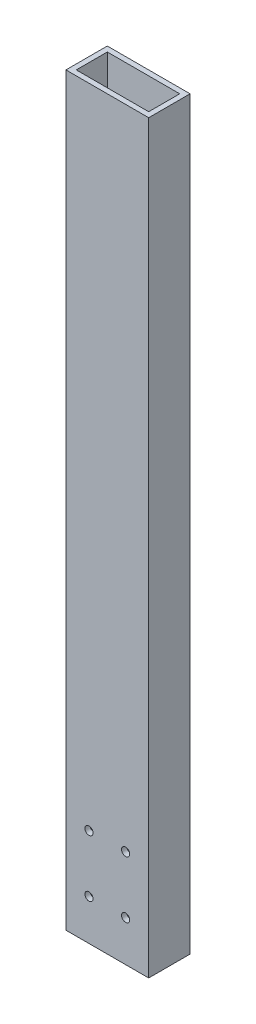
ISO-10303-21;
HEADER;
FILE_DESCRIPTION(('STEP AP214'),'2;1');
FILE_NAME('part.step','',(''),(''),'','','');
FILE_SCHEMA(('AUTOMOTIVE_DESIGN { 1 0 10303 214 1 1 1 1 }'));
ENDSEC;
DATA;
#1=APPLICATION_CONTEXT('core data for automotive mechanical design processes');
#2=APPLICATION_PROTOCOL_DEFINITION('international standard','automotive_design',2000,#1);
#3=PRODUCT_CONTEXT('',#1,'mechanical');
#4=PRODUCT('Part','Part','',(#3));
#5=PRODUCT_RELATED_PRODUCT_CATEGORY('part','',(#4));
#6=PRODUCT_DEFINITION_FORMATION('','',#4);
#7=PRODUCT_DEFINITION_CONTEXT('part definition',#1,'design');
#8=PRODUCT_DEFINITION('design','',#6,#7);
#9=PRODUCT_DEFINITION_SHAPE('','',#8);
#10=(LENGTH_UNIT() NAMED_UNIT(*) SI_UNIT(.MILLI.,.METRE.));
#11=(NAMED_UNIT(*) PLANE_ANGLE_UNIT() SI_UNIT($,.RADIAN.));
#12=(NAMED_UNIT(*) SI_UNIT($,.STERADIAN.) SOLID_ANGLE_UNIT());
#13=UNCERTAINTY_MEASURE_WITH_UNIT(LENGTH_MEASURE(1.E-05),#10,'distance_accuracy_value','');
#14=(GEOMETRIC_REPRESENTATION_CONTEXT(3) GLOBAL_UNCERTAINTY_ASSIGNED_CONTEXT((#13)) GLOBAL_UNIT_ASSIGNED_CONTEXT((#10,
#11,#12)) REPRESENTATION_CONTEXT('',''));
#15=CARTESIAN_POINT('',(0.,0.,0.));
#16=DIRECTION('',(0.,0.,1.));
#17=DIRECTION('',(1.,0.,0.));
#18=AXIS2_PLACEMENT_3D('',#15,#16,#17);
#19=CARTESIAN_POINT('',(0.,457.2,0.));
#20=DIRECTION('',(0.,-1.,0.));
#21=DIRECTION('',(0.,0.,-1.));
#22=AXIS2_PLACEMENT_3D('',#19,#20,#21);
#23=PLANE('',#22);
#24=DIRECTION('',(0.,0.,-1.));
#25=VECTOR('',#24,1.);
#26=CARTESIAN_POINT('',(25.4,457.2,12.7));
#27=LINE('',#26,#25);
#28=CARTESIAN_POINT('',(25.4,457.2,12.7));
#29=VERTEX_POINT('',#28);
#30=CARTESIAN_POINT('',(25.4,457.2,-12.7));
#31=VERTEX_POINT('',#30);
#32=EDGE_CURVE('E162',#29,#31,#27,.T.);
#33=ORIENTED_EDGE('',*,*,#32,.T.);
#34=DIRECTION('',(-1.,0.,0.));
#35=VECTOR('',#34,1.);
#36=CARTESIAN_POINT('',(-25.4,457.2,-12.7));
#37=LINE('',#36,#35);
#38=CARTESIAN_POINT('',(-25.4,457.2,-12.7));
#39=VERTEX_POINT('',#38);
#40=EDGE_CURVE('E166',#31,#39,#37,.T.);
#41=ORIENTED_EDGE('',*,*,#40,.T.);
#42=DIRECTION('',(0.,0.,1.));
#43=VECTOR('',#42,1.);
#44=CARTESIAN_POINT('',(-25.4,457.2,12.7));
#45=LINE('',#44,#43);
#46=CARTESIAN_POINT('',(-25.4,457.2,12.7));
#47=VERTEX_POINT('',#46);
#48=EDGE_CURVE('E170',#39,#47,#45,.T.);
#49=ORIENTED_EDGE('',*,*,#48,.T.);
#50=DIRECTION('',(1.,0.,0.));
#51=VECTOR('',#50,1.);
#52=CARTESIAN_POINT('',(-25.4,457.2,12.7));
#53=LINE('',#52,#51);
#54=EDGE_CURVE('E173',#47,#29,#53,.T.);
#55=ORIENTED_EDGE('',*,*,#54,.T.);
#56=EDGE_LOOP('',(#33,#41,#49,#55));
#57=FACE_BOUND('',#56,.T.);
#58=DIRECTION('',(0.,0.,-1.));
#59=VECTOR('',#58,1.);
#60=CARTESIAN_POINT('',(22.225,457.2,9.52499999999999));
#61=LINE('',#60,#59);
#62=CARTESIAN_POINT('',(22.225,457.2,9.52499999999999));
#63=VERTEX_POINT('',#62);
#64=CARTESIAN_POINT('',(22.225,457.2,-9.525));
#65=VERTEX_POINT('',#64);
#66=EDGE_CURVE('E112',#63,#65,#61,.T.);
#67=ORIENTED_EDGE('',*,*,#66,.F.);
#68=DIRECTION('',(1.,0.,0.));
#69=VECTOR('',#68,1.);
#70=CARTESIAN_POINT('',(-22.225,457.2,9.52499999999999));
#71=LINE('',#70,#69);
#72=CARTESIAN_POINT('',(-22.225,457.2,9.52499999999999));
#73=VERTEX_POINT('',#72);
#74=EDGE_CURVE('E138',#73,#63,#71,.T.);
#75=ORIENTED_EDGE('',*,*,#74,.F.);
#76=DIRECTION('',(0.,0.,1.));
#77=VECTOR('',#76,1.);
#78=CARTESIAN_POINT('',(-22.225,457.2,9.52499999999999));
#79=LINE('',#78,#77);
#80=CARTESIAN_POINT('',(-22.225,457.2,-9.52499999999999));
#81=VERTEX_POINT('',#80);
#82=EDGE_CURVE('E134',#81,#73,#79,.T.);
#83=ORIENTED_EDGE('',*,*,#82,.F.);
#84=DIRECTION('',(-1.,0.,0.));
#85=VECTOR('',#84,1.);
#86=CARTESIAN_POINT('',(-22.225,457.2,-9.52499999999999));
#87=LINE('',#86,#85);
#88=EDGE_CURVE('E121',#65,#81,#87,.T.);
#89=ORIENTED_EDGE('',*,*,#88,.F.);
#90=EDGE_LOOP('',(#67,#75,#83,#89));
#91=FACE_BOUND('',#90,.T.);
#92=ADVANCED_FACE('F44',(#57,#91),#23,.F.);
#93=CARTESIAN_POINT('',(0.,0.,0.));
#94=DIRECTION('',(0.,-1.,0.));
#95=DIRECTION('',(0.,0.,-1.));
#96=AXIS2_PLACEMENT_3D('',#93,#94,#95);
#97=PLANE('',#96);
#98=DIRECTION('',(0.,0.,-1.));
#99=VECTOR('',#98,1.);
#100=CARTESIAN_POINT('',(25.4,0.,12.7));
#101=LINE('',#100,#99);
#102=CARTESIAN_POINT('',(25.4,0.,12.7));
#103=VERTEX_POINT('',#102);
#104=CARTESIAN_POINT('',(25.4,0.,-12.7));
#105=VERTEX_POINT('',#104);
#106=EDGE_CURVE('E130',#103,#105,#101,.T.);
#107=ORIENTED_EDGE('',*,*,#106,.F.);
#108=DIRECTION('',(1.,0.,0.));
#109=VECTOR('',#108,1.);
#110=CARTESIAN_POINT('',(-25.4,0.,12.7));
#111=LINE('',#110,#109);
#112=CARTESIAN_POINT('',(-25.4,0.,12.7));
#113=VERTEX_POINT('',#112);
#114=EDGE_CURVE('E167',#113,#103,#111,.T.);
#115=ORIENTED_EDGE('',*,*,#114,.F.);
#116=DIRECTION('',(0.,0.,1.));
#117=VECTOR('',#116,1.);
#118=CARTESIAN_POINT('',(-25.4,0.,12.7));
#119=LINE('',#118,#117);
#120=CARTESIAN_POINT('',(-25.4,0.,-12.7));
#121=VERTEX_POINT('',#120);
#122=EDGE_CURVE('E183',#121,#113,#119,.T.);
#123=ORIENTED_EDGE('',*,*,#122,.F.);
#124=DIRECTION('',(-1.,0.,0.));
#125=VECTOR('',#124,1.);
#126=CARTESIAN_POINT('',(-25.4,0.,-12.7));
#127=LINE('',#126,#125);
#128=EDGE_CURVE('E180',#105,#121,#127,.T.);
#129=ORIENTED_EDGE('',*,*,#128,.F.);
#130=EDGE_LOOP('',(#107,#115,#123,#129));
#131=FACE_BOUND('',#130,.T.);
#132=DIRECTION('',(1.,0.,0.));
#133=VECTOR('',#132,1.);
#134=CARTESIAN_POINT('',(-22.225,0.,9.52499999999999));
#135=LINE('',#134,#133);
#136=CARTESIAN_POINT('',(-22.225,0.,9.52499999999999));
#137=VERTEX_POINT('',#136);
#138=CARTESIAN_POINT('',(22.225,0.,9.52499999999999));
#139=VERTEX_POINT('',#138);
#140=EDGE_CURVE('E122',#137,#139,#135,.T.);
#141=ORIENTED_EDGE('',*,*,#140,.T.);
#142=DIRECTION('',(0.,0.,-1.));
#143=VECTOR('',#142,1.);
#144=CARTESIAN_POINT('',(22.225,0.,9.52499999999999));
#145=LINE('',#144,#143);
#146=CARTESIAN_POINT('',(22.225,0.,-9.525));
#147=VERTEX_POINT('',#146);
#148=EDGE_CURVE('E70',#139,#147,#145,.T.);
#149=ORIENTED_EDGE('',*,*,#148,.T.);
#150=DIRECTION('',(-1.,0.,0.));
#151=VECTOR('',#150,1.);
#152=CARTESIAN_POINT('',(-22.225,0.,-9.52499999999999));
#153=LINE('',#152,#151);
#154=CARTESIAN_POINT('',(-22.225,0.,-9.52499999999999));
#155=VERTEX_POINT('',#154);
#156=EDGE_CURVE('E128',#147,#155,#153,.T.);
#157=ORIENTED_EDGE('',*,*,#156,.T.);
#158=DIRECTION('',(0.,0.,1.));
#159=VECTOR('',#158,1.);
#160=CARTESIAN_POINT('',(-22.225,0.,9.52499999999999));
#161=LINE('',#160,#159);
#162=EDGE_CURVE('E149',#155,#137,#161,.T.);
#163=ORIENTED_EDGE('',*,*,#162,.T.);
#164=EDGE_LOOP('',(#141,#149,#157,#163));
#165=FACE_BOUND('',#164,.T.);
#166=ADVANCED_FACE('F247',(#131,#165),#97,.T.);
#167=CARTESIAN_POINT('',(25.4,457.2,12.7));
#168=DIRECTION('',(-1.,0.,0.));
#169=DIRECTION('',(0.,0.,1.));
#170=AXIS2_PLACEMENT_3D('',#167,#168,#169);
#171=PLANE('',#170);
#172=ORIENTED_EDGE('',*,*,#106,.T.);
#173=DIRECTION('',(0.,-1.,0.));
#174=VECTOR('',#173,1.);
#175=CARTESIAN_POINT('',(25.4,457.2,-12.7));
#176=LINE('',#175,#174);
#177=EDGE_CURVE('E11',#31,#105,#176,.T.);
#178=ORIENTED_EDGE('',*,*,#177,.F.);
#179=ORIENTED_EDGE('',*,*,#32,.F.);
#180=DIRECTION('',(0.,-1.,0.));
#181=VECTOR('',#180,1.);
#182=CARTESIAN_POINT('',(25.4,457.2,12.7));
#183=LINE('',#182,#181);
#184=EDGE_CURVE('E176',#29,#103,#183,.T.);
#185=ORIENTED_EDGE('',*,*,#184,.T.);
#186=EDGE_LOOP('',(#172,#178,#179,#185));
#187=FACE_BOUND('',#186,.T.);
#188=ADVANCED_FACE('F46',(#187),#171,.F.);
#189=CARTESIAN_POINT('',(-25.4,457.2,-12.7));
#190=DIRECTION('',(0.,0.,1.));
#191=DIRECTION('',(1.,0.,0.));
#192=AXIS2_PLACEMENT_3D('',#189,#190,#191);
#193=PLANE('',#192);
#194=CARTESIAN_POINT('',(11.25,60.,-12.7));
#195=DIRECTION('',(0.,0.,1.));
#196=DIRECTION('',(1.,0.,0.));
#197=AXIS2_PLACEMENT_3D('',#194,#195,#196);
#198=CIRCLE('',#197,2.5);
#199=CARTESIAN_POINT('',(13.75,60.,-12.7));
#200=VERTEX_POINT('',#199);
#201=EDGE_CURVE('E284',#200,#200,#198,.T.);
#202=ORIENTED_EDGE('',*,*,#201,.T.);
#203=EDGE_LOOP('',(#202));
#204=FACE_BOUND('',#203,.T.);
#205=CARTESIAN_POINT('',(11.25,25.,-12.7));
#206=DIRECTION('',(0.,0.,1.));
#207=DIRECTION('',(1.,0.,0.));
#208=AXIS2_PLACEMENT_3D('',#205,#206,#207);
#209=CIRCLE('',#208,2.5);
#210=CARTESIAN_POINT('',(13.75,25.,-12.7));
#211=VERTEX_POINT('',#210);
#212=EDGE_CURVE('E288',#211,#211,#209,.T.);
#213=ORIENTED_EDGE('',*,*,#212,.T.);
#214=EDGE_LOOP('',(#213));
#215=FACE_BOUND('',#214,.T.);
#216=CARTESIAN_POINT('',(-11.25,25.,-12.7));
#217=DIRECTION('',(0.,0.,1.));
#218=DIRECTION('',(1.,0.,0.));
#219=AXIS2_PLACEMENT_3D('',#216,#217,#218);
#220=CIRCLE('',#219,2.5);
#221=CARTESIAN_POINT('',(-8.75,25.,-12.7));
#222=VERTEX_POINT('',#221);
#223=EDGE_CURVE('E292',#222,#222,#220,.T.);
#224=ORIENTED_EDGE('',*,*,#223,.T.);
#225=EDGE_LOOP('',(#224));
#226=FACE_BOUND('',#225,.T.);
#227=CARTESIAN_POINT('',(-11.25,60.,-12.7));
#228=DIRECTION('',(0.,0.,1.));
#229=DIRECTION('',(1.,0.,0.));
#230=AXIS2_PLACEMENT_3D('',#227,#228,#229);
#231=CIRCLE('',#230,2.5);
#232=CARTESIAN_POINT('',(-8.75,60.,-12.7));
#233=VERTEX_POINT('',#232);
#234=EDGE_CURVE('E203',#233,#233,#231,.T.);
#235=ORIENTED_EDGE('',*,*,#234,.T.);
#236=EDGE_LOOP('',(#235));
#237=FACE_BOUND('',#236,.T.);
#238=ORIENTED_EDGE('',*,*,#128,.T.);
#239=DIRECTION('',(0.,-1.,0.));
#240=VECTOR('',#239,1.);
#241=CARTESIAN_POINT('',(-25.4,457.2,-12.7));
#242=LINE('',#241,#240);
#243=EDGE_CURVE('E54',#39,#121,#242,.T.);
#244=ORIENTED_EDGE('',*,*,#243,.F.);
#245=ORIENTED_EDGE('',*,*,#40,.F.);
#246=ORIENTED_EDGE('',*,*,#177,.T.);
#247=EDGE_LOOP('',(#238,#244,#245,#246));
#248=FACE_BOUND('',#247,.T.);
#249=ADVANCED_FACE('F274',(#204,#215,#226,#237,#248),#193,.F.);
#250=CARTESIAN_POINT('',(-25.4,457.2,12.7));
#251=DIRECTION('',(1.,0.,0.));
#252=DIRECTION('',(0.,0.,-1.));
#253=AXIS2_PLACEMENT_3D('',#250,#251,#252);
#254=PLANE('',#253);
#255=ORIENTED_EDGE('',*,*,#122,.T.);
#256=DIRECTION('',(0.,-1.,0.));
#257=VECTOR('',#256,1.);
#258=CARTESIAN_POINT('',(-25.4,457.2,12.7));
#259=LINE('',#258,#257);
#260=EDGE_CURVE('E191',#47,#113,#259,.T.);
#261=ORIENTED_EDGE('',*,*,#260,.F.);
#262=ORIENTED_EDGE('',*,*,#48,.F.);
#263=ORIENTED_EDGE('',*,*,#243,.T.);
#264=EDGE_LOOP('',(#255,#261,#262,#263));
#265=FACE_BOUND('',#264,.T.);
#266=ADVANCED_FACE('F271',(#265),#254,.F.);
#267=CARTESIAN_POINT('',(-25.4,457.2,12.7));
#268=DIRECTION('',(0.,0.,-1.));
#269=DIRECTION('',(-1.,0.,0.));
#270=AXIS2_PLACEMENT_3D('',#267,#268,#269);
#271=PLANE('',#270);
#272=CARTESIAN_POINT('',(11.25,60.,12.7));
#273=DIRECTION('',(0.,0.,1.));
#274=DIRECTION('',(1.,0.,0.));
#275=AXIS2_PLACEMENT_3D('',#272,#273,#274);
#276=CIRCLE('',#275,2.5);
#277=CARTESIAN_POINT('',(13.75,60.,12.7));
#278=VERTEX_POINT('',#277);
#279=EDGE_CURVE('E317',#278,#278,#276,.T.);
#280=ORIENTED_EDGE('',*,*,#279,.F.);
#281=EDGE_LOOP('',(#280));
#282=FACE_BOUND('',#281,.T.);
#283=CARTESIAN_POINT('',(11.25,25.,12.7));
#284=DIRECTION('',(0.,0.,1.));
#285=DIRECTION('',(1.,0.,0.));
#286=AXIS2_PLACEMENT_3D('',#283,#284,#285);
#287=CIRCLE('',#286,2.5);
#288=CARTESIAN_POINT('',(13.75,25.,12.7));
#289=VERTEX_POINT('',#288);
#290=EDGE_CURVE('E323',#289,#289,#287,.T.);
#291=ORIENTED_EDGE('',*,*,#290,.F.);
#292=EDGE_LOOP('',(#291));
#293=FACE_BOUND('',#292,.T.);
#294=CARTESIAN_POINT('',(-11.25,25.,12.7));
#295=DIRECTION('',(0.,0.,1.));
#296=DIRECTION('',(1.,0.,0.));
#297=AXIS2_PLACEMENT_3D('',#294,#295,#296);
#298=CIRCLE('',#297,2.5);
#299=CARTESIAN_POINT('',(-8.75,25.,12.7));
#300=VERTEX_POINT('',#299);
#301=EDGE_CURVE('E313',#300,#300,#298,.T.);
#302=ORIENTED_EDGE('',*,*,#301,.F.);
#303=EDGE_LOOP('',(#302));
#304=FACE_BOUND('',#303,.T.);
#305=CARTESIAN_POINT('',(-11.25,60.,12.7));
#306=DIRECTION('',(0.,0.,1.));
#307=DIRECTION('',(1.,0.,0.));
#308=AXIS2_PLACEMENT_3D('',#305,#306,#307);
#309=CIRCLE('',#308,2.5);
#310=CARTESIAN_POINT('',(-8.75,60.,12.7));
#311=VERTEX_POINT('',#310);
#312=EDGE_CURVE('E309',#311,#311,#309,.T.);
#313=ORIENTED_EDGE('',*,*,#312,.F.);
#314=EDGE_LOOP('',(#313));
#315=FACE_BOUND('',#314,.T.);
#316=ORIENTED_EDGE('',*,*,#114,.T.);
#317=ORIENTED_EDGE('',*,*,#184,.F.);
#318=ORIENTED_EDGE('',*,*,#54,.F.);
#319=ORIENTED_EDGE('',*,*,#260,.T.);
#320=EDGE_LOOP('',(#316,#317,#318,#319));
#321=FACE_BOUND('',#320,.T.);
#322=ADVANCED_FACE('F268',(#282,#293,#304,#315,#321),#271,.F.);
#323=CARTESIAN_POINT('',(22.225,457.2,9.52499999999999));
#324=DIRECTION('',(-1.,0.,0.));
#325=DIRECTION('',(0.,0.,1.));
#326=AXIS2_PLACEMENT_3D('',#323,#324,#325);
#327=PLANE('',#326);
#328=ORIENTED_EDGE('',*,*,#148,.F.);
#329=DIRECTION('',(0.,-1.,0.));
#330=VECTOR('',#329,1.);
#331=CARTESIAN_POINT('',(22.225,457.2,9.52499999999999));
#332=LINE('',#331,#330);
#333=EDGE_CURVE('E116',#63,#139,#332,.T.);
#334=ORIENTED_EDGE('',*,*,#333,.F.);
#335=ORIENTED_EDGE('',*,*,#66,.T.);
#336=DIRECTION('',(0.,-1.,0.));
#337=VECTOR('',#336,1.);
#338=CARTESIAN_POINT('',(22.225,457.2,-9.525));
#339=LINE('',#338,#337);
#340=EDGE_CURVE('E115',#65,#147,#339,.T.);
#341=ORIENTED_EDGE('',*,*,#340,.T.);
#342=EDGE_LOOP('',(#328,#334,#335,#341));
#343=FACE_BOUND('',#342,.T.);
#344=ADVANCED_FACE('F114',(#343),#327,.T.);
#345=CARTESIAN_POINT('',(-22.225,457.2,-9.52499999999999));
#346=DIRECTION('',(0.,0.,1.));
#347=DIRECTION('',(1.,0.,0.));
#348=AXIS2_PLACEMENT_3D('',#345,#346,#347);
#349=PLANE('',#348);
#350=CARTESIAN_POINT('',(11.25,60.,-9.525));
#351=DIRECTION('',(0.,0.,1.));
#352=DIRECTION('',(1.,0.,0.));
#353=AXIS2_PLACEMENT_3D('',#350,#351,#352);
#354=CIRCLE('',#353,2.5);
#355=CARTESIAN_POINT('',(13.75,60.,-9.525));
#356=VERTEX_POINT('',#355);
#357=EDGE_CURVE('E146',#356,#356,#354,.T.);
#358=ORIENTED_EDGE('',*,*,#357,.F.);
#359=EDGE_LOOP('',(#358));
#360=FACE_BOUND('',#359,.T.);
#361=CARTESIAN_POINT('',(11.25,25.,-9.525));
#362=DIRECTION('',(0.,0.,1.));
#363=DIRECTION('',(1.,0.,0.));
#364=AXIS2_PLACEMENT_3D('',#361,#362,#363);
#365=CIRCLE('',#364,2.5);
#366=CARTESIAN_POINT('',(13.75,25.,-9.525));
#367=VERTEX_POINT('',#366);
#368=EDGE_CURVE('E211',#367,#367,#365,.T.);
#369=ORIENTED_EDGE('',*,*,#368,.F.);
#370=EDGE_LOOP('',(#369));
#371=FACE_BOUND('',#370,.T.);
#372=CARTESIAN_POINT('',(-11.25,25.,-9.525));
#373=DIRECTION('',(0.,0.,1.));
#374=DIRECTION('',(1.,0.,0.));
#375=AXIS2_PLACEMENT_3D('',#372,#373,#374);
#376=CIRCLE('',#375,2.5);
#377=CARTESIAN_POINT('',(-8.75,25.,-9.525));
#378=VERTEX_POINT('',#377);
#379=EDGE_CURVE('E207',#378,#378,#376,.T.);
#380=ORIENTED_EDGE('',*,*,#379,.F.);
#381=EDGE_LOOP('',(#380));
#382=FACE_BOUND('',#381,.T.);
#383=CARTESIAN_POINT('',(-11.25,60.,-9.525));
#384=DIRECTION('',(0.,0.,1.));
#385=DIRECTION('',(1.,0.,0.));
#386=AXIS2_PLACEMENT_3D('',#383,#384,#385);
#387=CIRCLE('',#386,2.5);
#388=CARTESIAN_POINT('',(-8.75,60.,-9.525));
#389=VERTEX_POINT('',#388);
#390=EDGE_CURVE('E202',#389,#389,#387,.T.);
#391=ORIENTED_EDGE('',*,*,#390,.F.);
#392=EDGE_LOOP('',(#391));
#393=FACE_BOUND('',#392,.T.);
#394=ORIENTED_EDGE('',*,*,#156,.F.);
#395=ORIENTED_EDGE('',*,*,#340,.F.);
#396=ORIENTED_EDGE('',*,*,#88,.T.);
#397=DIRECTION('',(0.,-1.,0.));
#398=VECTOR('',#397,1.);
#399=CARTESIAN_POINT('',(-22.225,457.2,-9.52499999999999));
#400=LINE('',#399,#398);
#401=EDGE_CURVE('E131',#81,#155,#400,.T.);
#402=ORIENTED_EDGE('',*,*,#401,.T.);
#403=EDGE_LOOP('',(#394,#395,#396,#402));
#404=FACE_BOUND('',#403,.T.);
#405=ADVANCED_FACE('F125',(#360,#371,#382,#393,#404),#349,.T.);
#406=CARTESIAN_POINT('',(-22.225,457.2,9.52499999999999));
#407=DIRECTION('',(1.,0.,0.));
#408=DIRECTION('',(0.,0.,-1.));
#409=AXIS2_PLACEMENT_3D('',#406,#407,#408);
#410=PLANE('',#409);
#411=ORIENTED_EDGE('',*,*,#162,.F.);
#412=ORIENTED_EDGE('',*,*,#401,.F.);
#413=ORIENTED_EDGE('',*,*,#82,.T.);
#414=DIRECTION('',(0.,-1.,0.));
#415=VECTOR('',#414,1.);
#416=CARTESIAN_POINT('',(-22.225,457.2,9.52499999999999));
#417=LINE('',#416,#415);
#418=EDGE_CURVE('E62',#73,#137,#417,.T.);
#419=ORIENTED_EDGE('',*,*,#418,.T.);
#420=EDGE_LOOP('',(#411,#412,#413,#419));
#421=FACE_BOUND('',#420,.T.);
#422=ADVANCED_FACE('F239',(#421),#410,.T.);
#423=CARTESIAN_POINT('',(-22.225,457.2,9.52499999999999));
#424=DIRECTION('',(0.,0.,-1.));
#425=DIRECTION('',(-1.,0.,0.));
#426=AXIS2_PLACEMENT_3D('',#423,#424,#425);
#427=PLANE('',#426);
#428=CARTESIAN_POINT('',(11.25,60.,9.52499999999999));
#429=DIRECTION('',(0.,0.,-1.));
#430=DIRECTION('',(-1.,0.,0.));
#431=AXIS2_PLACEMENT_3D('',#428,#429,#430);
#432=CIRCLE('',#431,2.5);
#433=CARTESIAN_POINT('',(8.75,60.,9.52499999999999));
#434=VERTEX_POINT('',#433);
#435=EDGE_CURVE('E48',#434,#434,#432,.T.);
#436=ORIENTED_EDGE('',*,*,#435,.F.);
#437=EDGE_LOOP('',(#436));
#438=FACE_BOUND('',#437,.T.);
#439=CARTESIAN_POINT('',(11.25,25.,9.52499999999999));
#440=DIRECTION('',(0.,0.,-1.));
#441=DIRECTION('',(-1.,0.,0.));
#442=AXIS2_PLACEMENT_3D('',#439,#440,#441);
#443=CIRCLE('',#442,2.5);
#444=CARTESIAN_POINT('',(8.75,25.,9.52499999999999));
#445=VERTEX_POINT('',#444);
#446=EDGE_CURVE('E208',#445,#445,#443,.T.);
#447=ORIENTED_EDGE('',*,*,#446,.F.);
#448=EDGE_LOOP('',(#447));
#449=FACE_BOUND('',#448,.T.);
#450=CARTESIAN_POINT('',(-11.25,25.,9.52499999999999));
#451=DIRECTION('',(0.,0.,-1.));
#452=DIRECTION('',(-1.,0.,0.));
#453=AXIS2_PLACEMENT_3D('',#450,#451,#452);
#454=CIRCLE('',#453,2.5);
#455=CARTESIAN_POINT('',(-13.75,25.,9.52499999999999));
#456=VERTEX_POINT('',#455);
#457=EDGE_CURVE('E204',#456,#456,#454,.T.);
#458=ORIENTED_EDGE('',*,*,#457,.F.);
#459=EDGE_LOOP('',(#458));
#460=FACE_BOUND('',#459,.T.);
#461=CARTESIAN_POINT('',(-11.25,60.,9.52499999999999));
#462=DIRECTION('',(0.,0.,-1.));
#463=DIRECTION('',(-1.,0.,0.));
#464=AXIS2_PLACEMENT_3D('',#461,#462,#463);
#465=CIRCLE('',#464,2.5);
#466=CARTESIAN_POINT('',(-13.75,60.,9.52499999999999));
#467=VERTEX_POINT('',#466);
#468=EDGE_CURVE('E198',#467,#467,#465,.T.);
#469=ORIENTED_EDGE('',*,*,#468,.F.);
#470=EDGE_LOOP('',(#469));
#471=FACE_BOUND('',#470,.T.);
#472=ORIENTED_EDGE('',*,*,#140,.F.);
#473=ORIENTED_EDGE('',*,*,#418,.F.);
#474=ORIENTED_EDGE('',*,*,#74,.T.);
#475=ORIENTED_EDGE('',*,*,#333,.T.);
#476=EDGE_LOOP('',(#472,#473,#474,#475));
#477=FACE_BOUND('',#476,.T.);
#478=ADVANCED_FACE('F235',(#438,#449,#460,#471,#477),#427,.T.);
#479=CARTESIAN_POINT('',(-11.25,60.,-12.7));
#480=DIRECTION('',(0.,0.,1.));
#481=DIRECTION('',(1.,0.,0.));
#482=AXIS2_PLACEMENT_3D('',#479,#480,#481);
#483=CYLINDRICAL_SURFACE('',#482,2.5);
#484=ORIENTED_EDGE('',*,*,#468,.T.);
#485=EDGE_LOOP('',(#484));
#486=FACE_BOUND('',#485,.T.);
#487=ORIENTED_EDGE('',*,*,#312,.T.);
#488=EDGE_LOOP('',(#487));
#489=FACE_BOUND('',#488,.T.);
#490=ADVANCED_FACE('F238',(#486,#489),#483,.F.);
#491=CARTESIAN_POINT('',(-11.25,25.,-12.7));
#492=DIRECTION('',(0.,0.,1.));
#493=DIRECTION('',(1.,0.,0.));
#494=AXIS2_PLACEMENT_3D('',#491,#492,#493);
#495=CYLINDRICAL_SURFACE('',#494,2.5);
#496=ORIENTED_EDGE('',*,*,#457,.T.);
#497=EDGE_LOOP('',(#496));
#498=FACE_BOUND('',#497,.T.);
#499=ORIENTED_EDGE('',*,*,#301,.T.);
#500=EDGE_LOOP('',(#499));
#501=FACE_BOUND('',#500,.T.);
#502=ADVANCED_FACE('F333',(#498,#501),#495,.F.);
#503=CARTESIAN_POINT('',(11.25,25.,-12.7));
#504=DIRECTION('',(0.,0.,1.));
#505=DIRECTION('',(1.,0.,0.));
#506=AXIS2_PLACEMENT_3D('',#503,#504,#505);
#507=CYLINDRICAL_SURFACE('',#506,2.5);
#508=ORIENTED_EDGE('',*,*,#446,.T.);
#509=EDGE_LOOP('',(#508));
#510=FACE_BOUND('',#509,.T.);
#511=ORIENTED_EDGE('',*,*,#290,.T.);
#512=EDGE_LOOP('',(#511));
#513=FACE_BOUND('',#512,.T.);
#514=ADVANCED_FACE('F345',(#510,#513),#507,.F.);
#515=CARTESIAN_POINT('',(11.25,60.,-12.7));
#516=DIRECTION('',(0.,0.,1.));
#517=DIRECTION('',(1.,0.,0.));
#518=AXIS2_PLACEMENT_3D('',#515,#516,#517);
#519=CYLINDRICAL_SURFACE('',#518,2.5);
#520=ORIENTED_EDGE('',*,*,#435,.T.);
#521=EDGE_LOOP('',(#520));
#522=FACE_BOUND('',#521,.T.);
#523=ORIENTED_EDGE('',*,*,#279,.T.);
#524=EDGE_LOOP('',(#523));
#525=FACE_BOUND('',#524,.T.);
#526=ADVANCED_FACE('F232',(#522,#525),#519,.F.);
#527=ORIENTED_EDGE('',*,*,#390,.T.);
#528=EDGE_LOOP('',(#527));
#529=FACE_BOUND('',#528,.T.);
#530=ORIENTED_EDGE('',*,*,#234,.F.);
#531=EDGE_LOOP('',(#530));
#532=FACE_BOUND('',#531,.T.);
#533=ADVANCED_FACE('F341',(#529,#532),#483,.F.);
#534=ORIENTED_EDGE('',*,*,#379,.T.);
#535=EDGE_LOOP('',(#534));
#536=FACE_BOUND('',#535,.T.);
#537=ORIENTED_EDGE('',*,*,#223,.F.);
#538=EDGE_LOOP('',(#537));
#539=FACE_BOUND('',#538,.T.);
#540=ADVANCED_FACE('F348',(#536,#539),#495,.F.);
#541=ORIENTED_EDGE('',*,*,#368,.T.);
#542=EDGE_LOOP('',(#541));
#543=FACE_BOUND('',#542,.T.);
#544=ORIENTED_EDGE('',*,*,#212,.F.);
#545=EDGE_LOOP('',(#544));
#546=FACE_BOUND('',#545,.T.);
#547=ADVANCED_FACE('F356',(#543,#546),#507,.F.);
#548=ORIENTED_EDGE('',*,*,#357,.T.);
#549=EDGE_LOOP('',(#548));
#550=FACE_BOUND('',#549,.T.);
#551=ORIENTED_EDGE('',*,*,#201,.F.);
#552=EDGE_LOOP('',(#551));
#553=FACE_BOUND('',#552,.T.);
#554=ADVANCED_FACE('F357',(#550,#553),#519,.F.);
#555=CLOSED_SHELL('',(#92,#166,#188,#249,#266,#322,#344,#405,#422,#478,#490,#502,#514,#526,#533,
#540,#547,#554));
#556=MANIFOLD_SOLID_BREP('B2',#555);
#557=ADVANCED_BREP_SHAPE_REPRESENTATION('',(#18,#556),#14);
#558=SHAPE_DEFINITION_REPRESENTATION(#9,#557);
ENDSEC;
END-ISO-10303-21;
